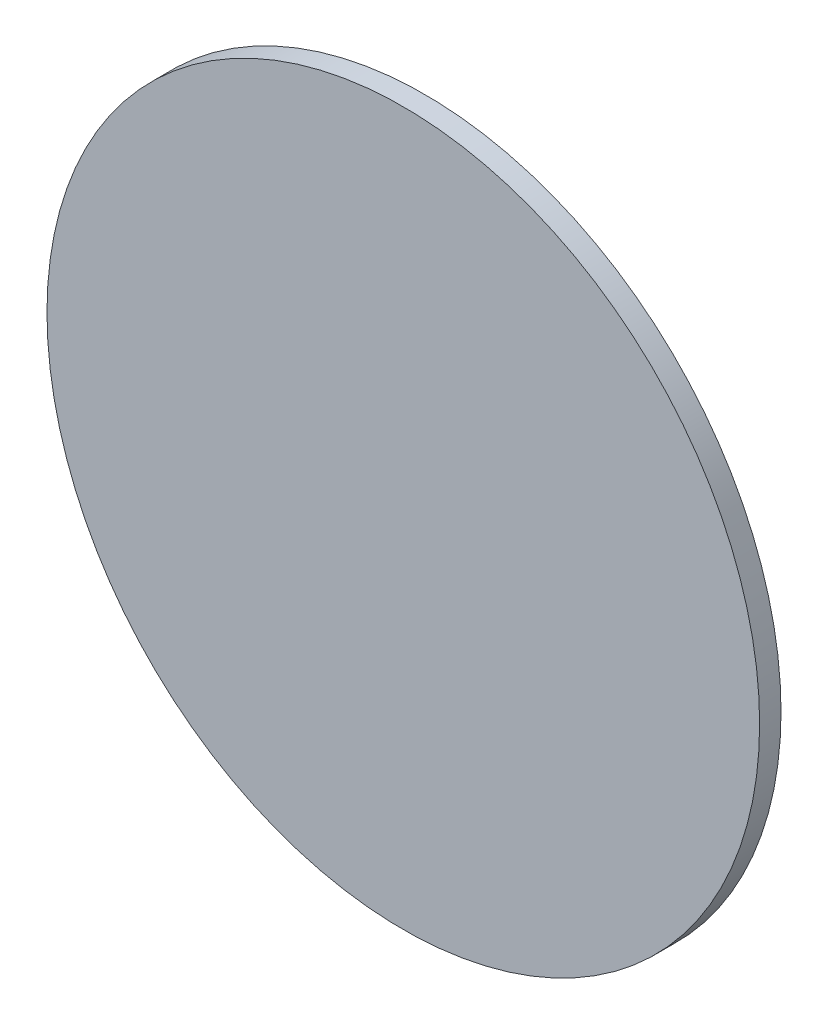
ISO-10303-21;
HEADER;
FILE_DESCRIPTION(('STEP AP214'),'2;1');
FILE_NAME('part.step','',(''),(''),'','','');
FILE_SCHEMA(('AUTOMOTIVE_DESIGN { 1 0 10303 214 1 1 1 1 }'));
ENDSEC;
DATA;
#1=APPLICATION_CONTEXT('core data for automotive mechanical design processes');
#2=APPLICATION_PROTOCOL_DEFINITION('international standard','automotive_design',2000,#1);
#3=PRODUCT_CONTEXT('',#1,'mechanical');
#4=PRODUCT('Part','Part','',(#3));
#5=PRODUCT_RELATED_PRODUCT_CATEGORY('part','',(#4));
#6=PRODUCT_DEFINITION_FORMATION('','',#4);
#7=PRODUCT_DEFINITION_CONTEXT('part definition',#1,'design');
#8=PRODUCT_DEFINITION('design','',#6,#7);
#9=PRODUCT_DEFINITION_SHAPE('','',#8);
#10=(LENGTH_UNIT() NAMED_UNIT(*) SI_UNIT(.MILLI.,.METRE.));
#11=(NAMED_UNIT(*) PLANE_ANGLE_UNIT() SI_UNIT($,.RADIAN.));
#12=(NAMED_UNIT(*) SI_UNIT($,.STERADIAN.) SOLID_ANGLE_UNIT());
#13=UNCERTAINTY_MEASURE_WITH_UNIT(LENGTH_MEASURE(1.E-05),#10,'distance_accuracy_value','');
#14=(GEOMETRIC_REPRESENTATION_CONTEXT(3) GLOBAL_UNCERTAINTY_ASSIGNED_CONTEXT((#13)) GLOBAL_UNIT_ASSIGNED_CONTEXT((#10,
#11,#12)) REPRESENTATION_CONTEXT('',''));
#15=CARTESIAN_POINT('',(0.,0.,0.));
#16=DIRECTION('',(0.,0.,1.));
#17=DIRECTION('',(1.,0.,0.));
#18=AXIS2_PLACEMENT_3D('',#15,#16,#17);
#19=CARTESIAN_POINT('',(0.,0.,3.));
#20=DIRECTION('',(0.,0.,-1.));
#21=DIRECTION('',(-1.,0.,0.));
#22=AXIS2_PLACEMENT_3D('',#19,#20,#21);
#23=CYLINDRICAL_SURFACE('',#22,50.);
#24=CARTESIAN_POINT('',(0.,0.,3.));
#25=DIRECTION('',(0.,0.,1.));
#26=DIRECTION('',(1.,0.,0.));
#27=AXIS2_PLACEMENT_3D('',#24,#25,#26);
#28=CIRCLE('',#27,50.);
#29=CARTESIAN_POINT('',(50.,0.,3.));
#30=VERTEX_POINT('',#29);
#31=EDGE_CURVE('E10',#30,#30,#28,.T.);
#32=ORIENTED_EDGE('',*,*,#31,.F.);
#33=EDGE_LOOP('',(#32));
#34=FACE_BOUND('',#33,.T.);
#35=CARTESIAN_POINT('',(0.,0.,0.));
#36=DIRECTION('',(0.,0.,1.));
#37=DIRECTION('',(1.,0.,0.));
#38=AXIS2_PLACEMENT_3D('',#35,#36,#37);
#39=CIRCLE('',#38,50.);
#40=CARTESIAN_POINT('',(50.,0.,0.));
#41=VERTEX_POINT('',#40);
#42=EDGE_CURVE('E40',#41,#41,#39,.T.);
#43=ORIENTED_EDGE('',*,*,#42,.T.);
#44=EDGE_LOOP('',(#43));
#45=FACE_BOUND('',#44,.T.);
#46=ADVANCED_FACE('F37',(#34,#45),#23,.T.);
#47=CARTESIAN_POINT('',(0.,0.,3.));
#48=DIRECTION('',(0.,0.,1.));
#49=DIRECTION('',(1.,0.,0.));
#50=AXIS2_PLACEMENT_3D('',#47,#48,#49);
#51=PLANE('',#50);
#52=ORIENTED_EDGE('',*,*,#31,.T.);
#53=EDGE_LOOP('',(#52));
#54=FACE_BOUND('',#53,.T.);
#55=ADVANCED_FACE('F54',(#54),#51,.T.);
#56=CARTESIAN_POINT('',(0.,0.,0.));
#57=DIRECTION('',(0.,0.,1.));
#58=DIRECTION('',(1.,0.,0.));
#59=AXIS2_PLACEMENT_3D('',#56,#57,#58);
#60=PLANE('',#59);
#61=ORIENTED_EDGE('',*,*,#42,.F.);
#62=EDGE_LOOP('',(#61));
#63=FACE_BOUND('',#62,.T.);
#64=ADVANCED_FACE('F52',(#63),#60,.F.);
#65=CLOSED_SHELL('',(#46,#55,#64));
#66=MANIFOLD_SOLID_BREP('B2',#65);
#67=ADVANCED_BREP_SHAPE_REPRESENTATION('',(#18,#66),#14);
#68=SHAPE_DEFINITION_REPRESENTATION(#9,#67);
ENDSEC;
END-ISO-10303-21;
